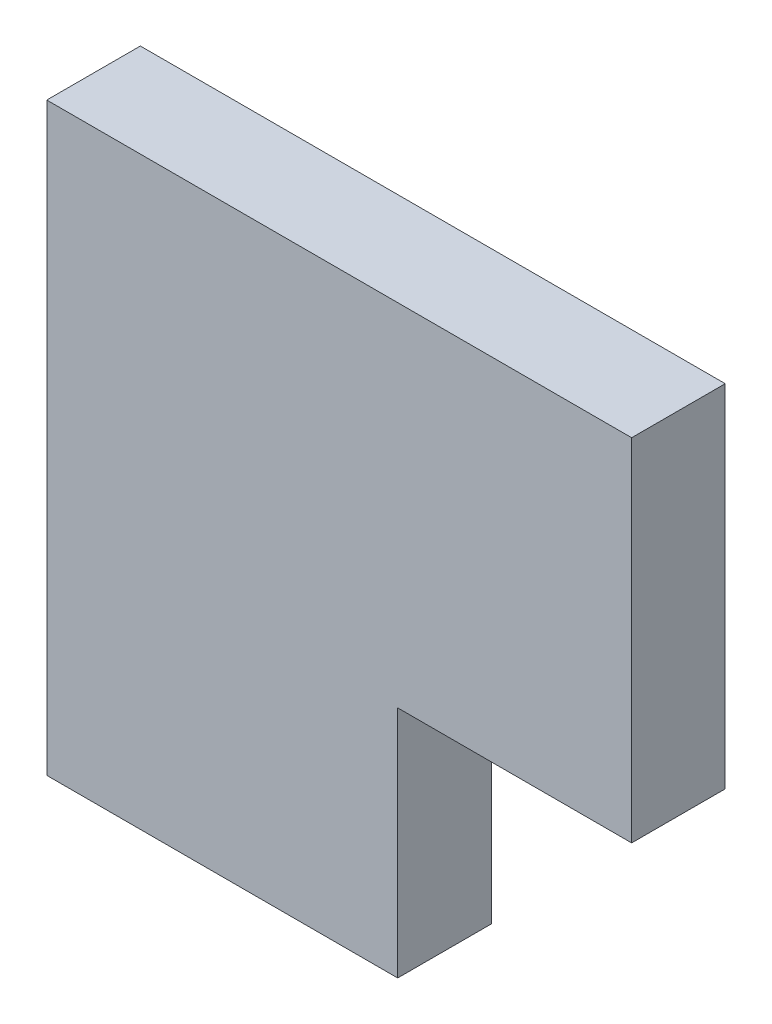
ISO-10303-21;
HEADER;
FILE_DESCRIPTION(('STEP AP214'),'2;1');
FILE_NAME('part.step','',(''),(''),'','','');
FILE_SCHEMA(('AUTOMOTIVE_DESIGN { 1 0 10303 214 1 1 1 1 }'));
ENDSEC;
DATA;
#1=APPLICATION_CONTEXT('core data for automotive mechanical design processes');
#2=APPLICATION_PROTOCOL_DEFINITION('international standard','automotive_design',2000,#1);
#3=PRODUCT_CONTEXT('',#1,'mechanical');
#4=PRODUCT('Part','Part','',(#3));
#5=PRODUCT_RELATED_PRODUCT_CATEGORY('part','',(#4));
#6=PRODUCT_DEFINITION_FORMATION('','',#4);
#7=PRODUCT_DEFINITION_CONTEXT('part definition',#1,'design');
#8=PRODUCT_DEFINITION('design','',#6,#7);
#9=PRODUCT_DEFINITION_SHAPE('','',#8);
#10=(LENGTH_UNIT() NAMED_UNIT(*) SI_UNIT(.MILLI.,.METRE.));
#11=(NAMED_UNIT(*) PLANE_ANGLE_UNIT() SI_UNIT($,.RADIAN.));
#12=(NAMED_UNIT(*) SI_UNIT($,.STERADIAN.) SOLID_ANGLE_UNIT());
#13=UNCERTAINTY_MEASURE_WITH_UNIT(LENGTH_MEASURE(1.E-05),#10,'distance_accuracy_value','');
#14=(GEOMETRIC_REPRESENTATION_CONTEXT(3) GLOBAL_UNCERTAINTY_ASSIGNED_CONTEXT((#13)) GLOBAL_UNIT_ASSIGNED_CONTEXT((#10,
#11,#12)) REPRESENTATION_CONTEXT('',''));
#15=CARTESIAN_POINT('',(0.,0.,0.));
#16=DIRECTION('',(0.,0.,1.));
#17=DIRECTION('',(1.,0.,0.));
#18=AXIS2_PLACEMENT_3D('',#15,#16,#17);
#19=CARTESIAN_POINT('',(-1.,0.,0.2));
#20=DIRECTION('',(0.,1.,0.));
#21=DIRECTION('',(0.,0.,1.));
#22=AXIS2_PLACEMENT_3D('',#19,#20,#21);
#23=PLANE('',#22);
#24=DIRECTION('',(1.,0.,0.));
#25=VECTOR('',#24,1.);
#26=CARTESIAN_POINT('',(-1.,0.,-0.2));
#27=LINE('',#26,#25);
#28=CARTESIAN_POINT('',(-1.,0.,-0.2));
#29=VERTEX_POINT('',#28);
#30=CARTESIAN_POINT('',(0.,0.,-0.2));
#31=VERTEX_POINT('',#30);
#32=EDGE_CURVE('E118',#29,#31,#27,.T.);
#33=ORIENTED_EDGE('',*,*,#32,.T.);
#34=DIRECTION('',(0.,0.,-1.));
#35=VECTOR('',#34,1.);
#36=CARTESIAN_POINT('',(0.,0.,0.2));
#37=LINE('',#36,#35);
#38=CARTESIAN_POINT('',(0.,0.,0.2));
#39=VERTEX_POINT('',#38);
#40=EDGE_CURVE('E11',#39,#31,#37,.T.);
#41=ORIENTED_EDGE('',*,*,#40,.F.);
#42=DIRECTION('',(1.,0.,0.));
#43=VECTOR('',#42,1.);
#44=CARTESIAN_POINT('',(-1.,0.,0.2));
#45=LINE('',#44,#43);
#46=CARTESIAN_POINT('',(-1.,0.,0.2));
#47=VERTEX_POINT('',#46);
#48=EDGE_CURVE('E128',#47,#39,#45,.T.);
#49=ORIENTED_EDGE('',*,*,#48,.F.);
#50=DIRECTION('',(0.,0.,-1.));
#51=VECTOR('',#50,1.);
#52=CARTESIAN_POINT('',(-1.,0.,0.2));
#53=LINE('',#52,#51);
#54=EDGE_CURVE('E114',#47,#29,#53,.T.);
#55=ORIENTED_EDGE('',*,*,#54,.T.);
#56=EDGE_LOOP('',(#33,#41,#49,#55));
#57=FACE_BOUND('',#56,.T.);
#58=ADVANCED_FACE('F34',(#57),#23,.F.);
#59=CARTESIAN_POINT('',(0.,0.,0.2));
#60=DIRECTION('',(-1.,0.,0.));
#61=DIRECTION('',(0.,0.,1.));
#62=AXIS2_PLACEMENT_3D('',#59,#60,#61);
#63=PLANE('',#62);
#64=DIRECTION('',(0.,1.,0.));
#65=VECTOR('',#64,1.);
#66=CARTESIAN_POINT('',(0.,0.,-0.2));
#67=LINE('',#66,#65);
#68=CARTESIAN_POINT('',(0.,1.5,-0.2));
#69=VERTEX_POINT('',#68);
#70=EDGE_CURVE('E121',#31,#69,#67,.T.);
#71=ORIENTED_EDGE('',*,*,#70,.T.);
#72=DIRECTION('',(0.,0.,-1.));
#73=VECTOR('',#72,1.);
#74=CARTESIAN_POINT('',(0.,1.5,0.2));
#75=LINE('',#74,#73);
#76=CARTESIAN_POINT('',(0.,1.5,0.2));
#77=VERTEX_POINT('',#76);
#78=EDGE_CURVE('E42',#77,#69,#75,.T.);
#79=ORIENTED_EDGE('',*,*,#78,.F.);
#80=DIRECTION('',(0.,1.,0.));
#81=VECTOR('',#80,1.);
#82=CARTESIAN_POINT('',(0.,0.,0.2));
#83=LINE('',#82,#81);
#84=EDGE_CURVE('E87',#39,#77,#83,.T.);
#85=ORIENTED_EDGE('',*,*,#84,.F.);
#86=ORIENTED_EDGE('',*,*,#40,.T.);
#87=EDGE_LOOP('',(#71,#79,#85,#86));
#88=FACE_BOUND('',#87,.T.);
#89=ADVANCED_FACE('F152',(#88),#63,.F.);
#90=CARTESIAN_POINT('',(0.,1.5,0.2));
#91=DIRECTION('',(0.,-1.,0.));
#92=DIRECTION('',(1.,0.,0.));
#93=AXIS2_PLACEMENT_3D('',#90,#91,#92);
#94=PLANE('',#93);
#95=DIRECTION('',(-1.,0.,0.));
#96=VECTOR('',#95,1.);
#97=CARTESIAN_POINT('',(0.,1.5,-0.2));
#98=LINE('',#97,#96);
#99=CARTESIAN_POINT('',(-2.5,1.5,-0.2));
#100=VERTEX_POINT('',#99);
#101=EDGE_CURVE('E123',#69,#100,#98,.T.);
#102=ORIENTED_EDGE('',*,*,#101,.T.);
#103=DIRECTION('',(0.,0.,-1.));
#104=VECTOR('',#103,1.);
#105=CARTESIAN_POINT('',(-2.5,1.5,0.2));
#106=LINE('',#105,#104);
#107=CARTESIAN_POINT('',(-2.5,1.5,0.2));
#108=VERTEX_POINT('',#107);
#109=EDGE_CURVE('E109',#108,#100,#106,.T.);
#110=ORIENTED_EDGE('',*,*,#109,.F.);
#111=DIRECTION('',(-1.,0.,0.));
#112=VECTOR('',#111,1.);
#113=CARTESIAN_POINT('',(0.,1.5,0.2));
#114=LINE('',#113,#112);
#115=EDGE_CURVE('E100',#77,#108,#114,.T.);
#116=ORIENTED_EDGE('',*,*,#115,.F.);
#117=ORIENTED_EDGE('',*,*,#78,.T.);
#118=EDGE_LOOP('',(#102,#110,#116,#117));
#119=FACE_BOUND('',#118,.T.);
#120=ADVANCED_FACE('F134',(#119),#94,.F.);
#121=CARTESIAN_POINT('',(-2.5,1.5,0.2));
#122=DIRECTION('',(1.,0.,0.));
#123=DIRECTION('',(0.,0.,-1.));
#124=AXIS2_PLACEMENT_3D('',#121,#122,#123);
#125=PLANE('',#124);
#126=DIRECTION('',(0.,-1.,0.));
#127=VECTOR('',#126,1.);
#128=CARTESIAN_POINT('',(-2.5,1.5,-0.2));
#129=LINE('',#128,#127);
#130=CARTESIAN_POINT('',(-2.5,-1.,-0.2));
#131=VERTEX_POINT('',#130);
#132=EDGE_CURVE('E108',#100,#131,#129,.T.);
#133=ORIENTED_EDGE('',*,*,#132,.T.);
#134=DIRECTION('',(0.,0.,-1.));
#135=VECTOR('',#134,1.);
#136=CARTESIAN_POINT('',(-2.5,-1.,0.2));
#137=LINE('',#136,#135);
#138=CARTESIAN_POINT('',(-2.5,-1.,0.2));
#139=VERTEX_POINT('',#138);
#140=EDGE_CURVE('E105',#139,#131,#137,.T.);
#141=ORIENTED_EDGE('',*,*,#140,.F.);
#142=DIRECTION('',(0.,-1.,0.));
#143=VECTOR('',#142,1.);
#144=CARTESIAN_POINT('',(-2.5,1.5,0.2));
#145=LINE('',#144,#143);
#146=EDGE_CURVE('E94',#108,#139,#145,.T.);
#147=ORIENTED_EDGE('',*,*,#146,.F.);
#148=ORIENTED_EDGE('',*,*,#109,.T.);
#149=EDGE_LOOP('',(#133,#141,#147,#148));
#150=FACE_BOUND('',#149,.T.);
#151=ADVANCED_FACE('F106',(#150),#125,.F.);
#152=CARTESIAN_POINT('',(-2.5,-1.,0.2));
#153=DIRECTION('',(0.,1.,0.));
#154=DIRECTION('',(0.,0.,1.));
#155=AXIS2_PLACEMENT_3D('',#152,#153,#154);
#156=PLANE('',#155);
#157=DIRECTION('',(1.,0.,0.));
#158=VECTOR('',#157,1.);
#159=CARTESIAN_POINT('',(-2.5,-1.,-0.2));
#160=LINE('',#159,#158);
#161=CARTESIAN_POINT('',(-1.,-1.,-0.2));
#162=VERTEX_POINT('',#161);
#163=EDGE_CURVE('E73',#131,#162,#160,.T.);
#164=ORIENTED_EDGE('',*,*,#163,.T.);
#165=DIRECTION('',(0.,0.,-1.));
#166=VECTOR('',#165,1.);
#167=CARTESIAN_POINT('',(-1.,-1.,0.2));
#168=LINE('',#167,#166);
#169=CARTESIAN_POINT('',(-1.,-1.,0.2));
#170=VERTEX_POINT('',#169);
#171=EDGE_CURVE('E110',#170,#162,#168,.T.);
#172=ORIENTED_EDGE('',*,*,#171,.F.);
#173=DIRECTION('',(1.,0.,0.));
#174=VECTOR('',#173,1.);
#175=CARTESIAN_POINT('',(-2.5,-1.,0.2));
#176=LINE('',#175,#174);
#177=EDGE_CURVE('E98',#139,#170,#176,.T.);
#178=ORIENTED_EDGE('',*,*,#177,.F.);
#179=ORIENTED_EDGE('',*,*,#140,.T.);
#180=EDGE_LOOP('',(#164,#172,#178,#179));
#181=FACE_BOUND('',#180,.T.);
#182=ADVANCED_FACE('F112',(#181),#156,.F.);
#183=CARTESIAN_POINT('',(-1.,-1.,0.2));
#184=DIRECTION('',(-1.,0.,0.));
#185=DIRECTION('',(0.,0.,1.));
#186=AXIS2_PLACEMENT_3D('',#183,#184,#185);
#187=PLANE('',#186);
#188=DIRECTION('',(0.,1.,0.));
#189=VECTOR('',#188,1.);
#190=CARTESIAN_POINT('',(-1.,-1.,-0.2));
#191=LINE('',#190,#189);
#192=EDGE_CURVE('E79',#162,#29,#191,.T.);
#193=ORIENTED_EDGE('',*,*,#192,.T.);
#194=ORIENTED_EDGE('',*,*,#54,.F.);
#195=DIRECTION('',(0.,1.,0.));
#196=VECTOR('',#195,1.);
#197=CARTESIAN_POINT('',(-1.,-1.,0.2));
#198=LINE('',#197,#196);
#199=EDGE_CURVE('E50',#170,#47,#198,.T.);
#200=ORIENTED_EDGE('',*,*,#199,.F.);
#201=ORIENTED_EDGE('',*,*,#171,.T.);
#202=EDGE_LOOP('',(#193,#194,#200,#201));
#203=FACE_BOUND('',#202,.T.);
#204=ADVANCED_FACE('F141',(#203),#187,.F.);
#205=CARTESIAN_POINT('',(0.,0.,0.2));
#206=DIRECTION('',(0.,0.,1.));
#207=DIRECTION('',(1.,0.,0.));
#208=AXIS2_PLACEMENT_3D('',#205,#206,#207);
#209=PLANE('',#208);
#210=ORIENTED_EDGE('',*,*,#48,.T.);
#211=ORIENTED_EDGE('',*,*,#84,.T.);
#212=ORIENTED_EDGE('',*,*,#115,.T.);
#213=ORIENTED_EDGE('',*,*,#146,.T.);
#214=ORIENTED_EDGE('',*,*,#177,.T.);
#215=ORIENTED_EDGE('',*,*,#199,.T.);
#216=EDGE_LOOP('',(#210,#211,#212,#213,#214,#215));
#217=FACE_BOUND('',#216,.T.);
#218=ADVANCED_FACE('F96',(#217),#209,.T.);
#219=CARTESIAN_POINT('',(0.,0.,-0.2));
#220=DIRECTION('',(0.,0.,1.));
#221=DIRECTION('',(1.,0.,0.));
#222=AXIS2_PLACEMENT_3D('',#219,#220,#221);
#223=PLANE('',#222);
#224=ORIENTED_EDGE('',*,*,#32,.F.);
#225=ORIENTED_EDGE('',*,*,#192,.F.);
#226=ORIENTED_EDGE('',*,*,#163,.F.);
#227=ORIENTED_EDGE('',*,*,#132,.F.);
#228=ORIENTED_EDGE('',*,*,#101,.F.);
#229=ORIENTED_EDGE('',*,*,#70,.F.);
#230=EDGE_LOOP('',(#224,#225,#226,#227,#228,#229));
#231=FACE_BOUND('',#230,.T.);
#232=ADVANCED_FACE('F137',(#231),#223,.F.);
#233=CLOSED_SHELL('',(#58,#89,#120,#151,#182,#204,#218,#232));
#234=MANIFOLD_SOLID_BREP('B2',#233);
#235=ADVANCED_BREP_SHAPE_REPRESENTATION('',(#18,#234),#14);
#236=SHAPE_DEFINITION_REPRESENTATION(#9,#235);
ENDSEC;
END-ISO-10303-21;
